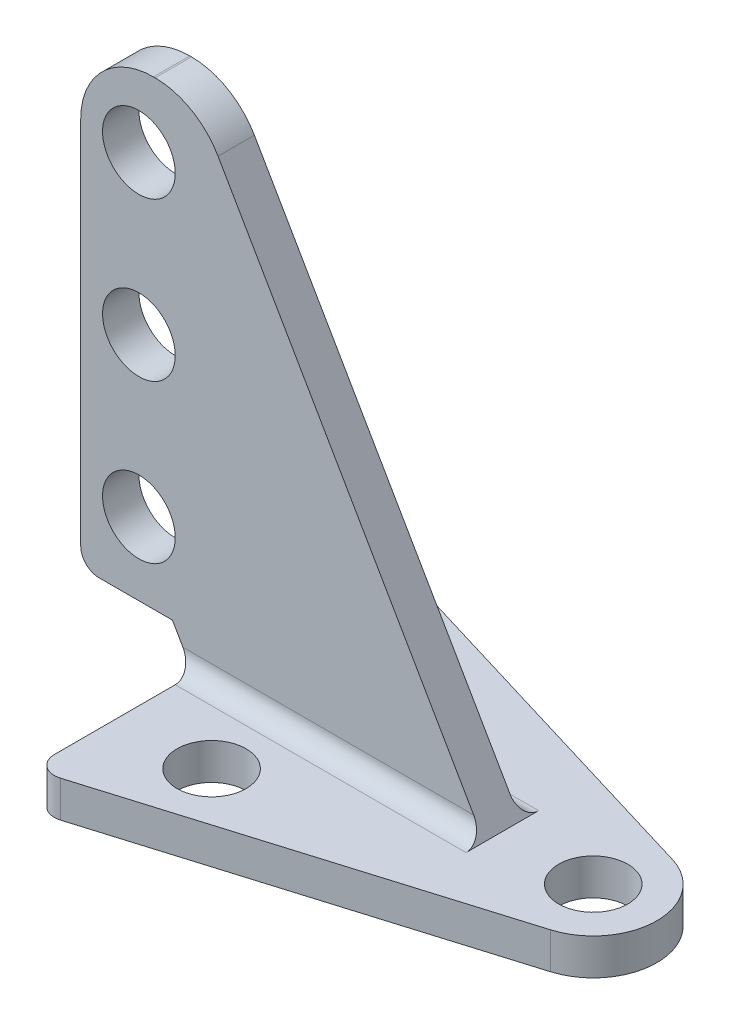
ISO-10303-21;
HEADER;
FILE_DESCRIPTION(('STEP AP214'),'2;1');
FILE_NAME('part.step','',(''),(''),'','','');
FILE_SCHEMA(('AUTOMOTIVE_DESIGN { 1 0 10303 214 1 1 1 1 }'));
ENDSEC;
DATA;
#1=APPLICATION_CONTEXT('core data for automotive mechanical design processes');
#2=APPLICATION_PROTOCOL_DEFINITION('international standard','automotive_design',2000,#1);
#3=PRODUCT_CONTEXT('',#1,'mechanical');
#4=PRODUCT('Part','Part','',(#3));
#5=PRODUCT_RELATED_PRODUCT_CATEGORY('part','',(#4));
#6=PRODUCT_DEFINITION_FORMATION('','',#4);
#7=PRODUCT_DEFINITION_CONTEXT('part definition',#1,'design');
#8=PRODUCT_DEFINITION('design','',#6,#7);
#9=PRODUCT_DEFINITION_SHAPE('','',#8);
#10=(LENGTH_UNIT() NAMED_UNIT(*) SI_UNIT(.MILLI.,.METRE.));
#11=(NAMED_UNIT(*) PLANE_ANGLE_UNIT() SI_UNIT($,.RADIAN.));
#12=(NAMED_UNIT(*) SI_UNIT($,.STERADIAN.) SOLID_ANGLE_UNIT());
#13=UNCERTAINTY_MEASURE_WITH_UNIT(LENGTH_MEASURE(1.E-05),#10,'distance_accuracy_value','');
#14=(GEOMETRIC_REPRESENTATION_CONTEXT(3) GLOBAL_UNCERTAINTY_ASSIGNED_CONTEXT((#13)) GLOBAL_UNIT_ASSIGNED_CONTEXT((#10,
#11,#12)) REPRESENTATION_CONTEXT('',''));
#15=CARTESIAN_POINT('',(0.,0.,0.));
#16=DIRECTION('',(0.,0.,1.));
#17=DIRECTION('',(1.,0.,0.));
#18=AXIS2_PLACEMENT_3D('',#15,#16,#17);
#19=CARTESIAN_POINT('',(8.,1.,0.));
#20=DIRECTION('',(0.,1.,0.));
#21=DIRECTION('',(0.,0.,1.));
#22=AXIS2_PLACEMENT_3D('',#19,#20,#21);
#23=PLANE('',#22);
#24=CARTESIAN_POINT('',(0.,1.,2.5));
#25=DIRECTION('',(0.,1.,0.));
#26=DIRECTION('',(0.,0.,1.));
#27=AXIS2_PLACEMENT_3D('',#24,#25,#26);
#28=CIRCLE('',#27,0.95);
#29=CARTESIAN_POINT('',(0.,1.,3.45));
#30=VERTEX_POINT('',#29);
#31=EDGE_CURVE('E235',#30,#30,#28,.T.);
#32=ORIENTED_EDGE('',*,*,#31,.F.);
#33=EDGE_LOOP('',(#32));
#34=FACE_BOUND('',#33,.T.);
#35=CARTESIAN_POINT('',(0.,1.,-2.5));
#36=DIRECTION('',(0.,1.,0.));
#37=DIRECTION('',(0.,0.,1.));
#38=AXIS2_PLACEMENT_3D('',#35,#36,#37);
#39=CIRCLE('',#38,0.95);
#40=CARTESIAN_POINT('',(0.,1.,-1.55));
#41=VERTEX_POINT('',#40);
#42=EDGE_CURVE('E243',#41,#41,#39,.T.);
#43=ORIENTED_EDGE('',*,*,#42,.F.);
#44=EDGE_LOOP('',(#43));
#45=FACE_BOUND('',#44,.T.);
#46=CARTESIAN_POINT('',(8.,1.,0.));
#47=DIRECTION('',(0.,1.,0.));
#48=DIRECTION('',(0.,0.,1.));
#49=AXIS2_PLACEMENT_3D('',#46,#47,#48);
#50=CIRCLE('',#49,0.949999999999999);
#51=CARTESIAN_POINT('',(8.,1.,0.949999999999999));
#52=VERTEX_POINT('',#51);
#53=EDGE_CURVE('E227',#52,#52,#50,.T.);
#54=ORIENTED_EDGE('',*,*,#53,.F.);
#55=EDGE_LOOP('',(#54));
#56=FACE_BOUND('',#55,.T.);
#57=DIRECTION('',(0.,0.,1.));
#58=VECTOR('',#57,1.);
#59=CARTESIAN_POINT('',(-2.5,1.,-5.));
#60=LINE('',#59,#58);
#61=CARTESIAN_POINT('',(-2.5,1.,-4.32664153928298));
#62=VERTEX_POINT('',#61);
#63=CARTESIAN_POINT('',(-2.5,1.,-1.));
#64=VERTEX_POINT('',#63);
#65=EDGE_CURVE('E257',#62,#64,#60,.T.);
#66=ORIENTED_EDGE('',*,*,#65,.T.);
#67=DIRECTION('',(1.,0.,0.));
#68=VECTOR('',#67,1.);
#69=CARTESIAN_POINT('',(5.5,1.,-1.));
#70=LINE('',#69,#68);
#71=CARTESIAN_POINT('',(5.5,1.,-1.));
#72=VERTEX_POINT('',#71);
#73=EDGE_CURVE('E337',#64,#72,#70,.T.);
#74=ORIENTED_EDGE('',*,*,#73,.T.);
#75=DIRECTION('',(0.,0.,-1.));
#76=VECTOR('',#75,1.);
#77=CARTESIAN_POINT('',(5.5,1.,0.5));
#78=LINE('',#77,#76);
#79=CARTESIAN_POINT('',(5.5,1.,1.));
#80=VERTEX_POINT('',#79);
#81=EDGE_CURVE('E206',#80,#72,#78,.T.);
#82=ORIENTED_EDGE('',*,*,#81,.F.);
#83=DIRECTION('',(1.,0.,0.));
#84=VECTOR('',#83,1.);
#85=CARTESIAN_POINT('',(8.,1.,1.));
#86=LINE('',#85,#84);
#87=CARTESIAN_POINT('',(-2.5,1.,1.));
#88=VERTEX_POINT('',#87);
#89=EDGE_CURVE('E333',#80,#88,#86,.F.);
#90=ORIENTED_EDGE('',*,*,#89,.T.);
#91=CARTESIAN_POINT('',(-2.5,1.,4.32664153928298));
#92=VERTEX_POINT('',#91);
#93=EDGE_CURVE('E255',#88,#92,#60,.T.);
#94=ORIENTED_EDGE('',*,*,#93,.T.);
#95=CARTESIAN_POINT('',(-2.,1.,4.32664153928298));
#96=DIRECTION('',(0.,1.,0.));
#97=DIRECTION('',(0.,0.,1.));
#98=AXIS2_PLACEMENT_3D('',#95,#96,#97);
#99=CIRCLE('',#98,0.5);
#100=CARTESIAN_POINT('',(-1.8554106786032,1.,4.80527911421626));
#101=VERTEX_POINT('',#100);
#102=EDGE_CURVE('E304',#92,#101,#99,.T.);
#103=ORIENTED_EDGE('',*,*,#102,.T.);
#104=DIRECTION('',(0.957275149866563,0.,-0.289178642793601));
#105=VECTOR('',#104,1.);
#106=CARTESIAN_POINT('',(-2.5,1.,5.));
#107=LINE('',#106,#105);
#108=CARTESIAN_POINT('',(8.5060626248888,1.,1.67523151226648));
#109=VERTEX_POINT('',#108);
#110=EDGE_CURVE('E261',#101,#109,#107,.T.);
#111=ORIENTED_EDGE('',*,*,#110,.T.);
#112=CARTESIAN_POINT('',(8.,1.,0.));
#113=DIRECTION('',(0.,1.,0.));
#114=DIRECTION('',(0.,0.,1.));
#115=AXIS2_PLACEMENT_3D('',#112,#113,#114);
#116=CIRCLE('',#115,1.75);
#117=CARTESIAN_POINT('',(8.5060626248888,1.,-1.67523151226648));
#118=VERTEX_POINT('',#117);
#119=EDGE_CURVE('E264',#109,#118,#116,.T.);
#120=ORIENTED_EDGE('',*,*,#119,.T.);
#121=DIRECTION('',(-0.957275149866563,0.,-0.289178642793601));
#122=VECTOR('',#121,1.);
#123=CARTESIAN_POINT('',(8.5060626248888,1.,-1.67523151226648));
#124=LINE('',#123,#122);
#125=CARTESIAN_POINT('',(-1.8554106786032,1.,-4.80527911421626));
#126=VERTEX_POINT('',#125);
#127=EDGE_CURVE('E251',#118,#126,#124,.T.);
#128=ORIENTED_EDGE('',*,*,#127,.T.);
#129=CARTESIAN_POINT('',(-2.,1.,-4.32664153928298));
#130=DIRECTION('',(0.,1.,0.));
#131=DIRECTION('',(0.,0.,1.));
#132=AXIS2_PLACEMENT_3D('',#129,#130,#131);
#133=CIRCLE('',#132,0.5);
#134=EDGE_CURVE('E307',#126,#62,#133,.T.);
#135=ORIENTED_EDGE('',*,*,#134,.T.);
#136=EDGE_LOOP('',(#66,#74,#82,#90,#94,#103,#111,#120,#128,#135));
#137=FACE_BOUND('',#136,.T.);
#138=ADVANCED_FACE('F43',(#34,#45,#56,#137),#23,.T.);
#139=CARTESIAN_POINT('',(8.,0.,0.));
#140=DIRECTION('',(0.,1.,0.));
#141=DIRECTION('',(0.,0.,1.));
#142=AXIS2_PLACEMENT_3D('',#139,#140,#141);
#143=PLANE('',#142);
#144=DIRECTION('',(0.,0.,1.));
#145=VECTOR('',#144,1.);
#146=CARTESIAN_POINT('',(-2.5,0.,-5.));
#147=LINE('',#146,#145);
#148=CARTESIAN_POINT('',(-2.5,0.,-4.32664153928298));
#149=VERTEX_POINT('',#148);
#150=CARTESIAN_POINT('',(-2.5,0.,4.32664153928298));
#151=VERTEX_POINT('',#150);
#152=EDGE_CURVE('E271',#149,#151,#147,.T.);
#153=ORIENTED_EDGE('',*,*,#152,.F.);
#154=CARTESIAN_POINT('',(-2.,0.,-4.32664153928298));
#155=DIRECTION('',(0.,1.,0.));
#156=DIRECTION('',(0.,0.,1.));
#157=AXIS2_PLACEMENT_3D('',#154,#155,#156);
#158=CIRCLE('',#157,0.5);
#159=CARTESIAN_POINT('',(-1.8554106786032,0.,-4.80527911421626));
#160=VERTEX_POINT('',#159);
#161=EDGE_CURVE('E298',#149,#160,#158,.F.);
#162=ORIENTED_EDGE('',*,*,#161,.T.);
#163=DIRECTION('',(-0.957275149866563,0.,-0.289178642793601));
#164=VECTOR('',#163,1.);
#165=CARTESIAN_POINT('',(8.5060626248888,0.,-1.67523151226648));
#166=LINE('',#165,#164);
#167=CARTESIAN_POINT('',(8.5060626248888,0.,-1.67523151226648));
#168=VERTEX_POINT('',#167);
#169=EDGE_CURVE('E247',#168,#160,#166,.T.);
#170=ORIENTED_EDGE('',*,*,#169,.F.);
#171=CARTESIAN_POINT('',(8.,0.,0.));
#172=DIRECTION('',(0.,1.,0.));
#173=DIRECTION('',(0.,0.,1.));
#174=AXIS2_PLACEMENT_3D('',#171,#172,#173);
#175=CIRCLE('',#174,1.75);
#176=CARTESIAN_POINT('',(8.5060626248888,0.,1.67523151226648));
#177=VERTEX_POINT('',#176);
#178=EDGE_CURVE('E256',#177,#168,#175,.T.);
#179=ORIENTED_EDGE('',*,*,#178,.F.);
#180=DIRECTION('',(0.957275149866563,0.,-0.289178642793601));
#181=VECTOR('',#180,1.);
#182=CARTESIAN_POINT('',(-2.5,0.,5.));
#183=LINE('',#182,#181);
#184=CARTESIAN_POINT('',(-1.8554106786032,0.,4.80527911421626));
#185=VERTEX_POINT('',#184);
#186=EDGE_CURVE('E275',#185,#177,#183,.T.);
#187=ORIENTED_EDGE('',*,*,#186,.F.);
#188=CARTESIAN_POINT('',(-2.,0.,4.32664153928298));
#189=DIRECTION('',(0.,1.,0.));
#190=DIRECTION('',(0.,0.,1.));
#191=AXIS2_PLACEMENT_3D('',#188,#189,#190);
#192=CIRCLE('',#191,0.5);
#193=EDGE_CURVE('E295',#185,#151,#192,.F.);
#194=ORIENTED_EDGE('',*,*,#193,.T.);
#195=EDGE_LOOP('',(#153,#162,#170,#179,#187,#194));
#196=FACE_BOUND('',#195,.T.);
#197=CARTESIAN_POINT('',(0.,0.,-2.5));
#198=DIRECTION('',(0.,1.,0.));
#199=DIRECTION('',(0.,0.,1.));
#200=AXIS2_PLACEMENT_3D('',#197,#198,#199);
#201=CIRCLE('',#200,0.95);
#202=CARTESIAN_POINT('',(0.,0.,-1.55));
#203=VERTEX_POINT('',#202);
#204=EDGE_CURVE('E239',#203,#203,#201,.T.);
#205=ORIENTED_EDGE('',*,*,#204,.T.);
#206=EDGE_LOOP('',(#205));
#207=FACE_BOUND('',#206,.T.);
#208=CARTESIAN_POINT('',(0.,0.,2.5));
#209=DIRECTION('',(0.,1.,0.));
#210=DIRECTION('',(0.,0.,1.));
#211=AXIS2_PLACEMENT_3D('',#208,#209,#210);
#212=CIRCLE('',#211,0.95);
#213=CARTESIAN_POINT('',(0.,0.,3.45));
#214=VERTEX_POINT('',#213);
#215=EDGE_CURVE('E231',#214,#214,#212,.T.);
#216=ORIENTED_EDGE('',*,*,#215,.T.);
#217=EDGE_LOOP('',(#216));
#218=FACE_BOUND('',#217,.T.);
#219=CARTESIAN_POINT('',(8.,0.,0.));
#220=DIRECTION('',(0.,1.,0.));
#221=DIRECTION('',(0.,0.,1.));
#222=AXIS2_PLACEMENT_3D('',#219,#220,#221);
#223=CIRCLE('',#222,0.949999999999999);
#224=CARTESIAN_POINT('',(8.,0.,0.949999999999999));
#225=VERTEX_POINT('',#224);
#226=EDGE_CURVE('E190',#225,#225,#223,.T.);
#227=ORIENTED_EDGE('',*,*,#226,.T.);
#228=EDGE_LOOP('',(#227));
#229=FACE_BOUND('',#228,.T.);
#230=ADVANCED_FACE('F410',(#196,#207,#218,#229),#143,.F.);
#231=CARTESIAN_POINT('',(8.5060626248888,1.,-1.67523151226648));
#232=DIRECTION('',(-0.289178642793602,0.,0.957275149866563));
#233=DIRECTION('',(0.957275149866563,0.,0.289178642793601));
#234=AXIS2_PLACEMENT_3D('',#231,#232,#233);
#235=PLANE('',#234);
#236=ORIENTED_EDGE('',*,*,#169,.T.);
#237=DIRECTION('',(0.,-1.,0.));
#238=VECTOR('',#237,1.);
#239=CARTESIAN_POINT('',(-1.8554106786032,1.,-4.80527911421626));
#240=LINE('',#239,#238);
#241=EDGE_CURVE('E301',#160,#126,#240,.F.);
#242=ORIENTED_EDGE('',*,*,#241,.T.);
#243=ORIENTED_EDGE('',*,*,#127,.F.);
#244=DIRECTION('',(0.,-1.,0.));
#245=VECTOR('',#244,1.);
#246=CARTESIAN_POINT('',(8.5060626248888,1.,-1.67523151226648));
#247=LINE('',#246,#245);
#248=EDGE_CURVE('E267',#118,#168,#247,.T.);
#249=ORIENTED_EDGE('',*,*,#248,.T.);
#250=EDGE_LOOP('',(#236,#242,#243,#249));
#251=FACE_BOUND('',#250,.T.);
#252=ADVANCED_FACE('F416',(#251),#235,.F.);
#253=CARTESIAN_POINT('',(-2.5,1.,-5.));
#254=DIRECTION('',(1.,0.,0.));
#255=DIRECTION('',(0.,0.,-1.));
#256=AXIS2_PLACEMENT_3D('',#253,#254,#255);
#257=PLANE('',#256);
#258=ORIENTED_EDGE('',*,*,#65,.F.);
#259=DIRECTION('',(0.,-1.,0.));
#260=VECTOR('',#259,1.);
#261=CARTESIAN_POINT('',(-2.5,1.,-4.32664153928298));
#262=LINE('',#261,#260);
#263=EDGE_CURVE('E291',#62,#149,#262,.T.);
#264=ORIENTED_EDGE('',*,*,#263,.T.);
#265=ORIENTED_EDGE('',*,*,#152,.T.);
#266=DIRECTION('',(0.,-1.,0.));
#267=VECTOR('',#266,1.);
#268=CARTESIAN_POINT('',(-2.5,1.,4.32664153928298));
#269=LINE('',#268,#267);
#270=EDGE_CURVE('E287',#151,#92,#269,.F.);
#271=ORIENTED_EDGE('',*,*,#270,.T.);
#272=ORIENTED_EDGE('',*,*,#93,.F.);
#273=DIRECTION('',(0.,0.,-1.));
#274=VECTOR('',#273,1.);
#275=CARTESIAN_POINT('',(-2.5,1.,0.5));
#276=LINE('',#275,#274);
#277=EDGE_CURVE('E191',#88,#64,#276,.T.);
#278=ORIENTED_EDGE('',*,*,#277,.T.);
#279=EDGE_LOOP('',(#258,#264,#265,#271,#272,#278));
#280=FACE_BOUND('',#279,.T.);
#281=ADVANCED_FACE('F432',(#280),#257,.F.);
#282=CARTESIAN_POINT('',(-2.5,1.,5.));
#283=DIRECTION('',(-0.289178642793602,0.,-0.957275149866563));
#284=DIRECTION('',(-0.957275149866563,0.,0.289178642793601));
#285=AXIS2_PLACEMENT_3D('',#282,#283,#284);
#286=PLANE('',#285);
#287=ORIENTED_EDGE('',*,*,#110,.F.);
#288=DIRECTION('',(0.,-1.,0.));
#289=VECTOR('',#288,1.);
#290=CARTESIAN_POINT('',(-1.8554106786032,1.,4.80527911421626));
#291=LINE('',#290,#289);
#292=EDGE_CURVE('E310',#101,#185,#291,.T.);
#293=ORIENTED_EDGE('',*,*,#292,.T.);
#294=ORIENTED_EDGE('',*,*,#186,.T.);
#295=DIRECTION('',(0.,-1.,0.));
#296=VECTOR('',#295,1.);
#297=CARTESIAN_POINT('',(8.5060626248888,1.,1.67523151226648));
#298=LINE('',#297,#296);
#299=EDGE_CURVE('E283',#109,#177,#298,.T.);
#300=ORIENTED_EDGE('',*,*,#299,.F.);
#301=EDGE_LOOP('',(#287,#293,#294,#300));
#302=FACE_BOUND('',#301,.T.);
#303=ADVANCED_FACE('F428',(#302),#286,.F.);
#304=CARTESIAN_POINT('',(8.,1.,0.));
#305=DIRECTION('',(0.,-1.,0.));
#306=DIRECTION('',(0.,0.,-1.));
#307=AXIS2_PLACEMENT_3D('',#304,#305,#306);
#308=CYLINDRICAL_SURFACE('',#307,1.75);
#309=ORIENTED_EDGE('',*,*,#178,.T.);
#310=ORIENTED_EDGE('',*,*,#248,.F.);
#311=ORIENTED_EDGE('',*,*,#119,.F.);
#312=ORIENTED_EDGE('',*,*,#299,.T.);
#313=EDGE_LOOP('',(#309,#310,#311,#312));
#314=FACE_BOUND('',#313,.T.);
#315=ADVANCED_FACE('F425',(#314),#308,.T.);
#316=CARTESIAN_POINT('',(0.,1.,-2.5));
#317=DIRECTION('',(0.,-1.,0.));
#318=DIRECTION('',(0.,0.,-1.));
#319=AXIS2_PLACEMENT_3D('',#316,#317,#318);
#320=CYLINDRICAL_SURFACE('',#319,0.95);
#321=ORIENTED_EDGE('',*,*,#42,.T.);
#322=EDGE_LOOP('',(#321));
#323=FACE_BOUND('',#322,.T.);
#324=ORIENTED_EDGE('',*,*,#204,.F.);
#325=EDGE_LOOP('',(#324));
#326=FACE_BOUND('',#325,.T.);
#327=ADVANCED_FACE('F422',(#323,#326),#320,.F.);
#328=CARTESIAN_POINT('',(0.,1.,2.5));
#329=DIRECTION('',(0.,-1.,0.));
#330=DIRECTION('',(0.,0.,-1.));
#331=AXIS2_PLACEMENT_3D('',#328,#329,#330);
#332=CYLINDRICAL_SURFACE('',#331,0.95);
#333=ORIENTED_EDGE('',*,*,#31,.T.);
#334=EDGE_LOOP('',(#333));
#335=FACE_BOUND('',#334,.T.);
#336=ORIENTED_EDGE('',*,*,#215,.F.);
#337=EDGE_LOOP('',(#336));
#338=FACE_BOUND('',#337,.T.);
#339=ADVANCED_FACE('F481',(#335,#338),#332,.F.);
#340=CARTESIAN_POINT('',(8.,1.,0.));
#341=DIRECTION('',(0.,-1.,0.));
#342=DIRECTION('',(0.,0.,-1.));
#343=AXIS2_PLACEMENT_3D('',#340,#341,#342);
#344=CYLINDRICAL_SURFACE('',#343,0.949999999999999);
#345=ORIENTED_EDGE('',*,*,#53,.T.);
#346=EDGE_LOOP('',(#345));
#347=FACE_BOUND('',#346,.T.);
#348=ORIENTED_EDGE('',*,*,#226,.F.);
#349=EDGE_LOOP('',(#348));
#350=FACE_BOUND('',#349,.T.);
#351=ADVANCED_FACE('F443',(#347,#350),#344,.F.);
#352=CARTESIAN_POINT('',(-2.,1.,-4.32664153928298));
#353=DIRECTION('',(0.,-1.,0.));
#354=DIRECTION('',(0.,0.,-1.));
#355=AXIS2_PLACEMENT_3D('',#352,#353,#354);
#356=CYLINDRICAL_SURFACE('',#355,0.5);
#357=ORIENTED_EDGE('',*,*,#134,.F.);
#358=ORIENTED_EDGE('',*,*,#241,.F.);
#359=ORIENTED_EDGE('',*,*,#161,.F.);
#360=ORIENTED_EDGE('',*,*,#263,.F.);
#361=EDGE_LOOP('',(#357,#358,#359,#360));
#362=FACE_BOUND('',#361,.T.);
#363=ADVANCED_FACE('F439',(#362),#356,.T.);
#364=CARTESIAN_POINT('',(-2.,1.,4.32664153928298));
#365=DIRECTION('',(0.,-1.,0.));
#366=DIRECTION('',(0.,0.,-1.));
#367=AXIS2_PLACEMENT_3D('',#364,#365,#366);
#368=CYLINDRICAL_SURFACE('',#367,0.5);
#369=ORIENTED_EDGE('',*,*,#102,.F.);
#370=ORIENTED_EDGE('',*,*,#270,.F.);
#371=ORIENTED_EDGE('',*,*,#193,.F.);
#372=ORIENTED_EDGE('',*,*,#292,.F.);
#373=EDGE_LOOP('',(#369,#370,#371,#372));
#374=FACE_BOUND('',#373,.T.);
#375=ADVANCED_FACE('F442',(#374),#368,.T.);
#376=CARTESIAN_POINT('',(0.,0.,0.5));
#377=DIRECTION('',(0.,0.,-1.));
#378=DIRECTION('',(-1.,0.,0.));
#379=AXIS2_PLACEMENT_3D('',#376,#377,#378);
#380=PLANE('',#379);
#381=DIRECTION('',(-0.499999999999998,0.86602540378444,0.));
#382=VECTOR('',#381,1.);
#383=CARTESIAN_POINT('',(-2.4,14.6832013797942,0.5));
#384=LINE('',#383,#382);
#385=CARTESIAN_POINT('',(5.21132486540519,1.5,0.5));
#386=VERTEX_POINT('',#385);
#387=CARTESIAN_POINT('',(-1.82264973081037,13.6832013797942,0.5));
#388=VERTEX_POINT('',#387);
#389=EDGE_CURVE('E197',#386,#388,#384,.T.);
#390=ORIENTED_EDGE('',*,*,#389,.T.);
#391=CARTESIAN_POINT('',(-3.55470053837925,12.6832013797942,0.5));
#392=DIRECTION('',(0.,0.,-1.));
#393=DIRECTION('',(-1.,0.,0.));
#394=AXIS2_PLACEMENT_3D('',#391,#392,#393);
#395=CIRCLE('',#394,2.);
#396=CARTESIAN_POINT('',(-3.55470053837926,14.6832013797942,0.5));
#397=VERTEX_POINT('',#396);
#398=EDGE_CURVE('E52',#388,#397,#395,.F.);
#399=ORIENTED_EDGE('',*,*,#398,.T.);
#400=DIRECTION('',(-1.,0.,0.));
#401=VECTOR('',#400,1.);
#402=CARTESIAN_POINT('',(-5.6,14.6832013797942,0.5));
#403=LINE('',#402,#401);
#404=CARTESIAN_POINT('',(-3.6,14.6832013797942,0.5));
#405=VERTEX_POINT('',#404);
#406=EDGE_CURVE('E200',#397,#405,#403,.T.);
#407=ORIENTED_EDGE('',*,*,#406,.T.);
#408=CARTESIAN_POINT('',(-3.6,12.6832013797942,0.5));
#409=DIRECTION('',(0.,0.,-1.));
#410=DIRECTION('',(-1.,0.,0.));
#411=AXIS2_PLACEMENT_3D('',#408,#409,#410);
#412=CIRCLE('',#411,2.);
#413=CARTESIAN_POINT('',(-5.6,12.6832013797942,0.5));
#414=VERTEX_POINT('',#413);
#415=EDGE_CURVE('E59',#405,#414,#412,.F.);
#416=ORIENTED_EDGE('',*,*,#415,.T.);
#417=DIRECTION('',(0.,-1.,0.));
#418=VECTOR('',#417,1.);
#419=CARTESIAN_POINT('',(-5.6,2.,0.5));
#420=LINE('',#419,#418);
#421=CARTESIAN_POINT('',(-5.6,2.5,0.5));
#422=VERTEX_POINT('',#421);
#423=EDGE_CURVE('E179',#414,#422,#420,.T.);
#424=ORIENTED_EDGE('',*,*,#423,.T.);
#425=CARTESIAN_POINT('',(-5.1,2.5,0.5));
#426=DIRECTION('',(0.,0.,-1.));
#427=DIRECTION('',(-1.,0.,0.));
#428=AXIS2_PLACEMENT_3D('',#425,#426,#427);
#429=CIRCLE('',#428,0.5);
#430=CARTESIAN_POINT('',(-5.1,2.,0.5));
#431=VERTEX_POINT('',#430);
#432=EDGE_CURVE('E174',#422,#431,#429,.F.);
#433=ORIENTED_EDGE('',*,*,#432,.T.);
#434=DIRECTION('',(1.,0.,0.));
#435=VECTOR('',#434,1.);
#436=CARTESIAN_POINT('',(-3.07735026918962,2.,0.5));
#437=LINE('',#436,#435);
#438=CARTESIAN_POINT('',(-3.07735026918962,2.,0.5));
#439=VERTEX_POINT('',#438);
#440=EDGE_CURVE('E165',#431,#439,#437,.T.);
#441=ORIENTED_EDGE('',*,*,#440,.T.);
#442=DIRECTION('',(0.499999999999998,-0.86602540378444,0.));
#443=VECTOR('',#442,1.);
#444=CARTESIAN_POINT('',(-2.5,1.,0.5));
#445=LINE('',#444,#443);
#446=CARTESIAN_POINT('',(-2.78867513459481,1.5,0.5));
#447=VERTEX_POINT('',#446);
#448=EDGE_CURVE('E171',#439,#447,#445,.T.);
#449=ORIENTED_EDGE('',*,*,#448,.T.);
#450=DIRECTION('',(1.,0.,0.));
#451=VECTOR('',#450,1.);
#452=CARTESIAN_POINT('',(0.,1.5,0.5));
#453=LINE('',#452,#451);
#454=EDGE_CURVE('E328',#447,#386,#453,.T.);
#455=ORIENTED_EDGE('',*,*,#454,.T.);
#456=EDGE_LOOP('',(#390,#399,#407,#416,#424,#433,#441,#449,#455));
#457=FACE_BOUND('',#456,.T.);
#458=CARTESIAN_POINT('',(-4.,4.,0.5));
#459=DIRECTION('',(0.,0.,1.));
#460=DIRECTION('',(1.,0.,0.));
#461=AXIS2_PLACEMENT_3D('',#458,#459,#460);
#462=CIRCLE('',#461,1.);
#463=CARTESIAN_POINT('',(-3.,4.,0.5));
#464=VERTEX_POINT('',#463);
#465=EDGE_CURVE('E210',#464,#464,#462,.T.);
#466=ORIENTED_EDGE('',*,*,#465,.F.);
#467=EDGE_LOOP('',(#466));
#468=FACE_BOUND('',#467,.T.);
#469=CARTESIAN_POINT('',(-4.,12.6832013797942,0.5));
#470=DIRECTION('',(0.,0.,1.));
#471=DIRECTION('',(1.,0.,0.));
#472=AXIS2_PLACEMENT_3D('',#469,#470,#471);
#473=CIRCLE('',#472,1.);
#474=CARTESIAN_POINT('',(-3.,12.6832013797942,0.5));
#475=VERTEX_POINT('',#474);
#476=EDGE_CURVE('E530',#475,#475,#473,.T.);
#477=ORIENTED_EDGE('',*,*,#476,.F.);
#478=EDGE_LOOP('',(#477));
#479=FACE_BOUND('',#478,.T.);
#480=CARTESIAN_POINT('',(-4.,8.3416006898971,0.5));
#481=DIRECTION('',(0.,0.,1.));
#482=DIRECTION('',(1.,0.,0.));
#483=AXIS2_PLACEMENT_3D('',#480,#481,#482);
#484=CIRCLE('',#483,1.);
#485=CARTESIAN_POINT('',(-3.,8.3416006898971,0.5));
#486=VERTEX_POINT('',#485);
#487=EDGE_CURVE('E519',#486,#486,#484,.T.);
#488=ORIENTED_EDGE('',*,*,#487,.F.);
#489=EDGE_LOOP('',(#488));
#490=FACE_BOUND('',#489,.T.);
#491=ADVANCED_FACE('F167',(#457,#468,#479,#490),#380,.F.);
#492=CARTESIAN_POINT('',(0.,0.,-0.5));
#493=DIRECTION('',(0.,0.,-1.));
#494=DIRECTION('',(-1.,0.,0.));
#495=AXIS2_PLACEMENT_3D('',#492,#493,#494);
#496=PLANE('',#495);
#497=CARTESIAN_POINT('',(-4.,12.6832013797942,-0.5));
#498=DIRECTION('',(0.,0.,1.));
#499=DIRECTION('',(1.,0.,0.));
#500=AXIS2_PLACEMENT_3D('',#497,#498,#499);
#501=CIRCLE('',#500,1.);
#502=CARTESIAN_POINT('',(-3.,12.6832013797942,-0.5));
#503=VERTEX_POINT('',#502);
#504=EDGE_CURVE('E527',#503,#503,#501,.T.);
#505=ORIENTED_EDGE('',*,*,#504,.T.);
#506=EDGE_LOOP('',(#505));
#507=FACE_BOUND('',#506,.T.);
#508=DIRECTION('',(-1.,0.,0.));
#509=VECTOR('',#508,1.);
#510=CARTESIAN_POINT('',(-5.6,14.6832013797942,-0.5));
#511=LINE('',#510,#509);
#512=CARTESIAN_POINT('',(-3.55470053837926,14.6832013797942,-0.5));
#513=VERTEX_POINT('',#512);
#514=CARTESIAN_POINT('',(-3.6,14.6832013797942,-0.5));
#515=VERTEX_POINT('',#514);
#516=EDGE_CURVE('E219',#513,#515,#511,.T.);
#517=ORIENTED_EDGE('',*,*,#516,.F.);
#518=CARTESIAN_POINT('',(-3.55470053837925,12.6832013797942,-0.5));
#519=DIRECTION('',(0.,0.,-1.));
#520=DIRECTION('',(-1.,0.,0.));
#521=AXIS2_PLACEMENT_3D('',#518,#519,#520);
#522=CIRCLE('',#521,2.);
#523=CARTESIAN_POINT('',(-1.82264973081037,13.6832013797942,-0.5));
#524=VERTEX_POINT('',#523);
#525=EDGE_CURVE('E364',#513,#524,#522,.T.);
#526=ORIENTED_EDGE('',*,*,#525,.T.);
#527=DIRECTION('',(-0.499999999999998,0.86602540378444,0.));
#528=VECTOR('',#527,1.);
#529=CARTESIAN_POINT('',(-2.4,14.6832013797942,-0.5));
#530=LINE('',#529,#528);
#531=CARTESIAN_POINT('',(5.21132486540519,1.5,-0.5));
#532=VERTEX_POINT('',#531);
#533=EDGE_CURVE('E216',#532,#524,#530,.T.);
#534=ORIENTED_EDGE('',*,*,#533,.F.);
#535=DIRECTION('',(1.,0.,0.));
#536=VECTOR('',#535,1.);
#537=CARTESIAN_POINT('',(-2.5,1.5,-0.5));
#538=LINE('',#537,#536);
#539=CARTESIAN_POINT('',(-2.78867513459481,1.5,-0.5));
#540=VERTEX_POINT('',#539);
#541=EDGE_CURVE('E317',#532,#540,#538,.F.);
#542=ORIENTED_EDGE('',*,*,#541,.T.);
#543=DIRECTION('',(0.499999999999998,-0.86602540378444,0.));
#544=VECTOR('',#543,1.);
#545=CARTESIAN_POINT('',(-2.5,1.,-0.5));
#546=LINE('',#545,#544);
#547=CARTESIAN_POINT('',(-3.07735026918962,2.,-0.5));
#548=VERTEX_POINT('',#547);
#549=EDGE_CURVE('E213',#548,#540,#546,.T.);
#550=ORIENTED_EDGE('',*,*,#549,.F.);
#551=DIRECTION('',(1.,0.,0.));
#552=VECTOR('',#551,1.);
#553=CARTESIAN_POINT('',(-3.07735026918962,2.,-0.5));
#554=LINE('',#553,#552);
#555=CARTESIAN_POINT('',(-5.1,2.,-0.5));
#556=VERTEX_POINT('',#555);
#557=EDGE_CURVE('E185',#556,#548,#554,.T.);
#558=ORIENTED_EDGE('',*,*,#557,.F.);
#559=CARTESIAN_POINT('',(-5.1,2.5,-0.5));
#560=DIRECTION('',(0.,0.,-1.));
#561=DIRECTION('',(-1.,0.,0.));
#562=AXIS2_PLACEMENT_3D('',#559,#560,#561);
#563=CIRCLE('',#562,0.5);
#564=CARTESIAN_POINT('',(-5.6,2.5,-0.5));
#565=VERTEX_POINT('',#564);
#566=EDGE_CURVE('E320',#556,#565,#563,.T.);
#567=ORIENTED_EDGE('',*,*,#566,.T.);
#568=DIRECTION('',(0.,-1.,0.));
#569=VECTOR('',#568,1.);
#570=CARTESIAN_POINT('',(-5.6,2.,-0.5));
#571=LINE('',#570,#569);
#572=CARTESIAN_POINT('',(-5.6,12.6832013797942,-0.5));
#573=VERTEX_POINT('',#572);
#574=EDGE_CURVE('E207',#573,#565,#571,.T.);
#575=ORIENTED_EDGE('',*,*,#574,.F.);
#576=CARTESIAN_POINT('',(-3.6,12.6832013797942,-0.5));
#577=DIRECTION('',(0.,0.,-1.));
#578=DIRECTION('',(-1.,0.,0.));
#579=AXIS2_PLACEMENT_3D('',#576,#577,#578);
#580=CIRCLE('',#579,2.);
#581=EDGE_CURVE('E361',#573,#515,#580,.T.);
#582=ORIENTED_EDGE('',*,*,#581,.T.);
#583=EDGE_LOOP('',(#517,#526,#534,#542,#550,#558,#567,#575,#582));
#584=FACE_BOUND('',#583,.T.);
#585=CARTESIAN_POINT('',(-4.,4.,-0.5));
#586=DIRECTION('',(0.,0.,1.));
#587=DIRECTION('',(1.,0.,0.));
#588=AXIS2_PLACEMENT_3D('',#585,#586,#587);
#589=CIRCLE('',#588,1.);
#590=CARTESIAN_POINT('',(-3.,4.,-0.5));
#591=VERTEX_POINT('',#590);
#592=EDGE_CURVE('E534',#591,#591,#589,.T.);
#593=ORIENTED_EDGE('',*,*,#592,.T.);
#594=EDGE_LOOP('',(#593));
#595=FACE_BOUND('',#594,.T.);
#596=CARTESIAN_POINT('',(-4.,8.3416006898971,-0.5));
#597=DIRECTION('',(0.,0.,1.));
#598=DIRECTION('',(1.,0.,0.));
#599=AXIS2_PLACEMENT_3D('',#596,#597,#598);
#600=CIRCLE('',#599,1.);
#601=CARTESIAN_POINT('',(-3.,8.3416006898971,-0.5));
#602=VERTEX_POINT('',#601);
#603=EDGE_CURVE('E522',#602,#602,#600,.T.);
#604=ORIENTED_EDGE('',*,*,#603,.T.);
#605=EDGE_LOOP('',(#604));
#606=FACE_BOUND('',#605,.T.);
#607=ADVANCED_FACE('F382',(#507,#584,#595,#606),#496,.T.);
#608=CARTESIAN_POINT('',(-5.6,2.,0.5));
#609=DIRECTION('',(1.,0.,0.));
#610=DIRECTION('',(0.,0.,-1.));
#611=AXIS2_PLACEMENT_3D('',#608,#609,#610);
#612=PLANE('',#611);
#613=ORIENTED_EDGE('',*,*,#423,.F.);
#614=DIRECTION('',(0.,0.,-1.));
#615=VECTOR('',#614,1.);
#616=CARTESIAN_POINT('',(-5.6,12.6832013797942,0.5));
#617=LINE('',#616,#615);
#618=EDGE_CURVE('E11',#414,#573,#617,.T.);
#619=ORIENTED_EDGE('',*,*,#618,.T.);
#620=ORIENTED_EDGE('',*,*,#574,.T.);
#621=DIRECTION('',(0.,0.,-1.));
#622=VECTOR('',#621,1.);
#623=CARTESIAN_POINT('',(-5.6,2.5,0.5));
#624=LINE('',#623,#622);
#625=EDGE_CURVE('E324',#565,#422,#624,.F.);
#626=ORIENTED_EDGE('',*,*,#625,.T.);
#627=EDGE_LOOP('',(#613,#619,#620,#626));
#628=FACE_BOUND('',#627,.T.);
#629=ADVANCED_FACE('F401',(#628),#612,.F.);
#630=CARTESIAN_POINT('',(-3.07735026918962,2.,0.5));
#631=DIRECTION('',(0.,1.,0.));
#632=DIRECTION('',(-1.,0.,0.));
#633=AXIS2_PLACEMENT_3D('',#630,#631,#632);
#634=PLANE('',#633);
#635=ORIENTED_EDGE('',*,*,#440,.F.);
#636=DIRECTION('',(0.,0.,-1.));
#637=VECTOR('',#636,1.);
#638=CARTESIAN_POINT('',(-5.1,2.,0.5));
#639=LINE('',#638,#637);
#640=EDGE_CURVE('E314',#431,#556,#639,.T.);
#641=ORIENTED_EDGE('',*,*,#640,.T.);
#642=ORIENTED_EDGE('',*,*,#557,.T.);
#643=DIRECTION('',(0.,0.,-1.));
#644=VECTOR('',#643,1.);
#645=CARTESIAN_POINT('',(-3.07735026918962,2.,0.5));
#646=LINE('',#645,#644);
#647=EDGE_CURVE('E182',#439,#548,#646,.T.);
#648=ORIENTED_EDGE('',*,*,#647,.F.);
#649=EDGE_LOOP('',(#635,#641,#642,#648));
#650=FACE_BOUND('',#649,.T.);
#651=ADVANCED_FACE('F183',(#650),#634,.F.);
#652=CARTESIAN_POINT('',(-2.5,1.,0.5));
#653=DIRECTION('',(0.86602540378444,0.499999999999998,0.));
#654=DIRECTION('',(-0.499999999999998,0.86602540378444,0.));
#655=AXIS2_PLACEMENT_3D('',#652,#653,#654);
#656=PLANE('',#655);
#657=ORIENTED_EDGE('',*,*,#549,.T.);
#658=CARTESIAN_POINT('',(-2.78867513459481,1.5,-1.));
#659=DIRECTION('',(0.86602540378444,0.499999999999998,0.));
#660=DIRECTION('',(-0.499999999999998,0.86602540378444,0.));
#661=AXIS2_PLACEMENT_3D('',#658,#659,#660);
#662=ELLIPSE('',#661,0.577350269189625,0.5);
#663=EDGE_CURVE('E344',#540,#64,#662,.T.);
#664=ORIENTED_EDGE('',*,*,#663,.T.);
#665=ORIENTED_EDGE('',*,*,#277,.F.);
#666=CARTESIAN_POINT('',(-2.78867513459481,1.5,1.));
#667=DIRECTION('',(0.86602540378444,0.499999999999998,0.));
#668=DIRECTION('',(0.499999999999998,-0.86602540378444,0.));
#669=AXIS2_PLACEMENT_3D('',#666,#667,#668);
#670=ELLIPSE('',#669,0.577350269189625,0.5);
#671=EDGE_CURVE('E195',#88,#447,#670,.T.);
#672=ORIENTED_EDGE('',*,*,#671,.T.);
#673=ORIENTED_EDGE('',*,*,#448,.F.);
#674=ORIENTED_EDGE('',*,*,#647,.T.);
#675=EDGE_LOOP('',(#657,#664,#665,#672,#673,#674));
#676=FACE_BOUND('',#675,.T.);
#677=ADVANCED_FACE('F193',(#676),#656,.F.);
#678=CARTESIAN_POINT('',(-2.4,14.6832013797942,0.5));
#679=DIRECTION('',(-0.86602540378444,-0.499999999999998,0.));
#680=DIRECTION('',(0.499999999999998,-0.86602540378444,0.));
#681=AXIS2_PLACEMENT_3D('',#678,#679,#680);
#682=PLANE('',#681);
#683=ORIENTED_EDGE('',*,*,#533,.T.);
#684=DIRECTION('',(0.,0.,-1.));
#685=VECTOR('',#684,1.);
#686=CARTESIAN_POINT('',(-1.82264973081037,13.6832013797942,0.5));
#687=LINE('',#686,#685);
#688=EDGE_CURVE('E67',#524,#388,#687,.F.);
#689=ORIENTED_EDGE('',*,*,#688,.T.);
#690=ORIENTED_EDGE('',*,*,#389,.F.);
#691=CARTESIAN_POINT('',(5.21132486540519,1.5,1.));
#692=DIRECTION('',(-0.86602540378444,-0.499999999999998,0.));
#693=DIRECTION('',(0.499999999999998,-0.86602540378444,0.));
#694=AXIS2_PLACEMENT_3D('',#691,#692,#693);
#695=ELLIPSE('',#694,0.577350269189625,0.5);
#696=EDGE_CURVE('E348',#386,#80,#695,.T.);
#697=ORIENTED_EDGE('',*,*,#696,.T.);
#698=ORIENTED_EDGE('',*,*,#81,.T.);
#699=CARTESIAN_POINT('',(5.21132486540519,1.5,-1.));
#700=DIRECTION('',(-0.86602540378444,-0.499999999999998,0.));
#701=DIRECTION('',(-0.499999999999998,0.86602540378444,0.));
#702=AXIS2_PLACEMENT_3D('',#699,#700,#701);
#703=ELLIPSE('',#702,0.577350269189625,0.5);
#704=EDGE_CURVE('E341',#72,#532,#703,.T.);
#705=ORIENTED_EDGE('',*,*,#704,.T.);
#706=EDGE_LOOP('',(#683,#689,#690,#697,#698,#705));
#707=FACE_BOUND('',#706,.T.);
#708=ADVANCED_FACE('F385',(#707),#682,.F.);
#709=CARTESIAN_POINT('',(-5.6,14.6832013797942,0.5));
#710=DIRECTION('',(0.,-1.,0.));
#711=DIRECTION('',(0.,0.,-1.));
#712=AXIS2_PLACEMENT_3D('',#709,#710,#711);
#713=PLANE('',#712);
#714=ORIENTED_EDGE('',*,*,#406,.F.);
#715=DIRECTION('',(0.,0.,-1.));
#716=VECTOR('',#715,1.);
#717=CARTESIAN_POINT('',(-3.55470053837925,14.6832013797942,0.5));
#718=LINE('',#717,#716);
#719=EDGE_CURVE('E357',#397,#513,#718,.T.);
#720=ORIENTED_EDGE('',*,*,#719,.T.);
#721=ORIENTED_EDGE('',*,*,#516,.T.);
#722=DIRECTION('',(0.,0.,-1.));
#723=VECTOR('',#722,1.);
#724=CARTESIAN_POINT('',(-3.6,14.6832013797942,0.5));
#725=LINE('',#724,#723);
#726=EDGE_CURVE('E354',#515,#405,#725,.F.);
#727=ORIENTED_EDGE('',*,*,#726,.T.);
#728=EDGE_LOOP('',(#714,#720,#721,#727));
#729=FACE_BOUND('',#728,.T.);
#730=ADVANCED_FACE('F376',(#729),#713,.F.);
#731=CARTESIAN_POINT('',(-4.,4.,0.5));
#732=DIRECTION('',(0.,0.,-1.));
#733=DIRECTION('',(-1.,0.,0.));
#734=AXIS2_PLACEMENT_3D('',#731,#732,#733);
#735=CYLINDRICAL_SURFACE('',#734,1.);
#736=ORIENTED_EDGE('',*,*,#465,.T.);
#737=EDGE_LOOP('',(#736));
#738=FACE_BOUND('',#737,.T.);
#739=ORIENTED_EDGE('',*,*,#592,.F.);
#740=EDGE_LOOP('',(#739));
#741=FACE_BOUND('',#740,.T.);
#742=ADVANCED_FACE('F499',(#738,#741),#735,.F.);
#743=CARTESIAN_POINT('',(-4.,12.6832013797942,0.5));
#744=DIRECTION('',(0.,0.,-1.));
#745=DIRECTION('',(-1.,0.,0.));
#746=AXIS2_PLACEMENT_3D('',#743,#744,#745);
#747=CYLINDRICAL_SURFACE('',#746,1.);
#748=ORIENTED_EDGE('',*,*,#476,.T.);
#749=EDGE_LOOP('',(#748));
#750=FACE_BOUND('',#749,.T.);
#751=ORIENTED_EDGE('',*,*,#504,.F.);
#752=EDGE_LOOP('',(#751));
#753=FACE_BOUND('',#752,.T.);
#754=ADVANCED_FACE('F507',(#750,#753),#747,.F.);
#755=CARTESIAN_POINT('',(-4.,8.3416006898971,0.5));
#756=DIRECTION('',(0.,0.,-1.));
#757=DIRECTION('',(-1.,0.,0.));
#758=AXIS2_PLACEMENT_3D('',#755,#756,#757);
#759=CYLINDRICAL_SURFACE('',#758,1.);
#760=ORIENTED_EDGE('',*,*,#487,.T.);
#761=EDGE_LOOP('',(#760));
#762=FACE_BOUND('',#761,.T.);
#763=ORIENTED_EDGE('',*,*,#603,.F.);
#764=EDGE_LOOP('',(#763));
#765=FACE_BOUND('',#764,.T.);
#766=ADVANCED_FACE('F450',(#762,#765),#759,.F.);
#767=CARTESIAN_POINT('',(-5.1,2.5,0.5));
#768=DIRECTION('',(0.,0.,-1.));
#769=DIRECTION('',(-1.,0.,0.));
#770=AXIS2_PLACEMENT_3D('',#767,#768,#769);
#771=CYLINDRICAL_SURFACE('',#770,0.5);
#772=ORIENTED_EDGE('',*,*,#432,.F.);
#773=ORIENTED_EDGE('',*,*,#625,.F.);
#774=ORIENTED_EDGE('',*,*,#566,.F.);
#775=ORIENTED_EDGE('',*,*,#640,.F.);
#776=EDGE_LOOP('',(#772,#773,#774,#775));
#777=FACE_BOUND('',#776,.T.);
#778=ADVANCED_FACE('F399',(#777),#771,.T.);
#779=CARTESIAN_POINT('',(8.,1.5,-1.));
#780=DIRECTION('',(-1.,0.,0.));
#781=DIRECTION('',(0.,0.,1.));
#782=AXIS2_PLACEMENT_3D('',#779,#780,#781);
#783=CYLINDRICAL_SURFACE('',#782,0.5);
#784=ORIENTED_EDGE('',*,*,#663,.F.);
#785=ORIENTED_EDGE('',*,*,#541,.F.);
#786=ORIENTED_EDGE('',*,*,#704,.F.);
#787=ORIENTED_EDGE('',*,*,#73,.F.);
#788=EDGE_LOOP('',(#784,#785,#786,#787));
#789=FACE_BOUND('',#788,.T.);
#790=ADVANCED_FACE('F390',(#789),#783,.F.);
#791=CARTESIAN_POINT('',(0.,1.5,1.));
#792=DIRECTION('',(1.,0.,0.));
#793=DIRECTION('',(0.,0.,-1.));
#794=AXIS2_PLACEMENT_3D('',#791,#792,#793);
#795=CYLINDRICAL_SURFACE('',#794,0.5);
#796=ORIENTED_EDGE('',*,*,#671,.F.);
#797=ORIENTED_EDGE('',*,*,#89,.F.);
#798=ORIENTED_EDGE('',*,*,#696,.F.);
#799=ORIENTED_EDGE('',*,*,#454,.F.);
#800=EDGE_LOOP('',(#796,#797,#798,#799));
#801=FACE_BOUND('',#800,.T.);
#802=ADVANCED_FACE('F408',(#801),#795,.F.);
#803=CARTESIAN_POINT('',(-3.55470053837925,12.6832013797942,0.5));
#804=DIRECTION('',(0.,0.,-1.));
#805=DIRECTION('',(-1.,0.,0.));
#806=AXIS2_PLACEMENT_3D('',#803,#804,#805);
#807=CYLINDRICAL_SURFACE('',#806,2.);
#808=ORIENTED_EDGE('',*,*,#398,.F.);
#809=ORIENTED_EDGE('',*,*,#688,.F.);
#810=ORIENTED_EDGE('',*,*,#525,.F.);
#811=ORIENTED_EDGE('',*,*,#719,.F.);
#812=EDGE_LOOP('',(#808,#809,#810,#811));
#813=FACE_BOUND('',#812,.T.);
#814=ADVANCED_FACE('F379',(#813),#807,.T.);
#815=CARTESIAN_POINT('',(-3.6,12.6832013797942,0.5));
#816=DIRECTION('',(0.,0.,-1.));
#817=DIRECTION('',(-1.,0.,0.));
#818=AXIS2_PLACEMENT_3D('',#815,#816,#817);
#819=CYLINDRICAL_SURFACE('',#818,2.);
#820=ORIENTED_EDGE('',*,*,#415,.F.);
#821=ORIENTED_EDGE('',*,*,#726,.F.);
#822=ORIENTED_EDGE('',*,*,#581,.F.);
#823=ORIENTED_EDGE('',*,*,#618,.F.);
#824=EDGE_LOOP('',(#820,#821,#822,#823));
#825=FACE_BOUND('',#824,.T.);
#826=ADVANCED_FACE('F45',(#825),#819,.T.);
#827=CLOSED_SHELL('',(#138,#230,#252,#281,#303,#315,#327,#339,#351,#363,#375,#491,#607,#629,
#651,#677,#708,#730,#742,#754,#766,#778,#790,#802,#814,#826));
#828=MANIFOLD_SOLID_BREP('B2',#827);
#829=ADVANCED_BREP_SHAPE_REPRESENTATION('',(#18,#828),#14);
#830=SHAPE_DEFINITION_REPRESENTATION(#9,#829);
ENDSEC;
END-ISO-10303-21;
